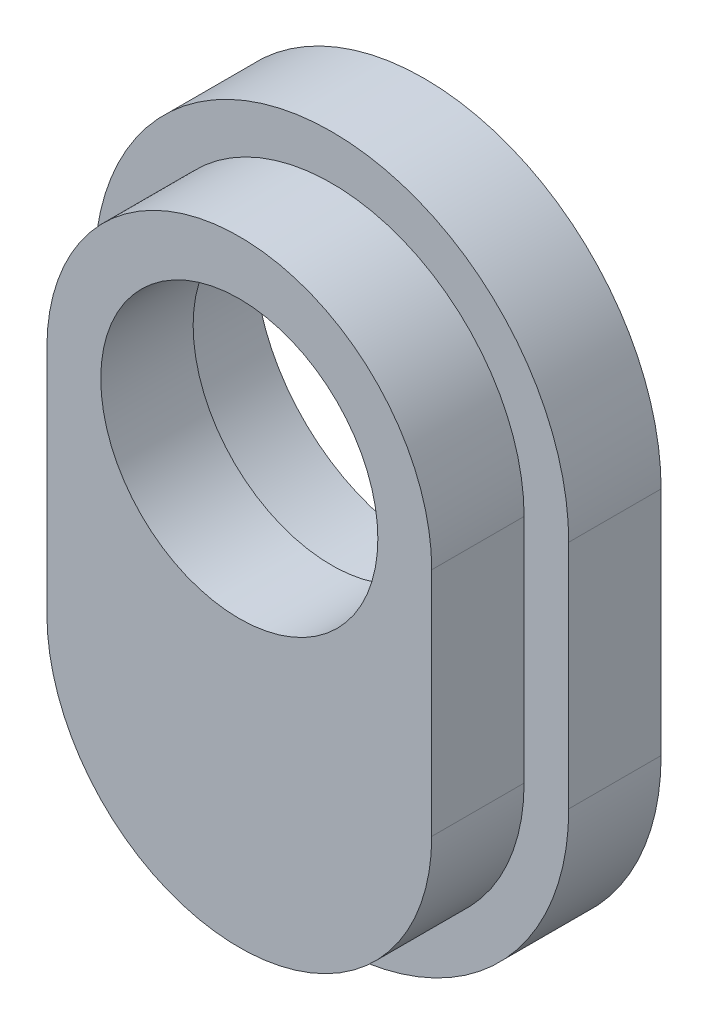
ISO-10303-21;
HEADER;
FILE_DESCRIPTION(('STEP AP214'),'2;1');
FILE_NAME('part.step','',(''),(''),'','','');
FILE_SCHEMA(('AUTOMOTIVE_DESIGN { 1 0 10303 214 1 1 1 1 }'));
ENDSEC;
DATA;
#1=APPLICATION_CONTEXT('core data for automotive mechanical design processes');
#2=APPLICATION_PROTOCOL_DEFINITION('international standard','automotive_design',2000,#1);
#3=PRODUCT_CONTEXT('',#1,'mechanical');
#4=PRODUCT('Part','Part','',(#3));
#5=PRODUCT_RELATED_PRODUCT_CATEGORY('part','',(#4));
#6=PRODUCT_DEFINITION_FORMATION('','',#4);
#7=PRODUCT_DEFINITION_CONTEXT('part definition',#1,'design');
#8=PRODUCT_DEFINITION('design','',#6,#7);
#9=PRODUCT_DEFINITION_SHAPE('','',#8);
#10=(LENGTH_UNIT() NAMED_UNIT(*) SI_UNIT(.MILLI.,.METRE.));
#11=(NAMED_UNIT(*) PLANE_ANGLE_UNIT() SI_UNIT($,.RADIAN.));
#12=(NAMED_UNIT(*) SI_UNIT($,.STERADIAN.) SOLID_ANGLE_UNIT());
#13=UNCERTAINTY_MEASURE_WITH_UNIT(LENGTH_MEASURE(1.E-05),#10,'distance_accuracy_value','');
#14=(GEOMETRIC_REPRESENTATION_CONTEXT(3) GLOBAL_UNCERTAINTY_ASSIGNED_CONTEXT((#13)) GLOBAL_UNIT_ASSIGNED_CONTEXT((#10,
#11,#12)) REPRESENTATION_CONTEXT('',''));
#15=CARTESIAN_POINT('',(0.,0.,0.));
#16=DIRECTION('',(0.,0.,1.));
#17=DIRECTION('',(1.,0.,0.));
#18=AXIS2_PLACEMENT_3D('',#15,#16,#17);
#19=CARTESIAN_POINT('',(0.,0.,6.));
#20=DIRECTION('',(0.,0.,-1.));
#21=DIRECTION('',(-1.,0.,0.));
#22=AXIS2_PLACEMENT_3D('',#19,#20,#21);
#23=CYLINDRICAL_SURFACE('',#22,4.5);
#24=CARTESIAN_POINT('',(0.,0.,6.));
#25=DIRECTION('',(0.,0.,1.));
#26=DIRECTION('',(1.,0.,0.));
#27=AXIS2_PLACEMENT_3D('',#24,#25,#26);
#28=CIRCLE('',#27,4.5);
#29=CARTESIAN_POINT('',(4.5,0.,6.));
#30=VERTEX_POINT('',#29);
#31=EDGE_CURVE('E152',#30,#30,#28,.T.);
#32=ORIENTED_EDGE('',*,*,#31,.T.);
#33=EDGE_LOOP('',(#32));
#34=FACE_BOUND('',#33,.T.);
#35=CARTESIAN_POINT('',(0.,0.,3.));
#36=DIRECTION('',(0.,0.,-1.));
#37=DIRECTION('',(-1.,0.,0.));
#38=AXIS2_PLACEMENT_3D('',#35,#36,#37);
#39=CIRCLE('',#38,4.5);
#40=CARTESIAN_POINT('',(-4.5,0.,3.));
#41=VERTEX_POINT('',#40);
#42=EDGE_CURVE('E36',#41,#41,#39,.T.);
#43=ORIENTED_EDGE('',*,*,#42,.T.);
#44=EDGE_LOOP('',(#43));
#45=FACE_BOUND('',#44,.T.);
#46=ADVANCED_FACE('F32',(#34,#45),#23,.F.);
#47=CARTESIAN_POINT('',(0.,0.,6.));
#48=DIRECTION('',(0.,0.,-1.));
#49=DIRECTION('',(-1.,0.,0.));
#50=AXIS2_PLACEMENT_3D('',#47,#48,#49);
#51=CYLINDRICAL_SURFACE('',#50,6.25);
#52=CARTESIAN_POINT('',(0.,0.,3.));
#53=DIRECTION('',(0.,0.,-1.));
#54=DIRECTION('',(-1.,0.,0.));
#55=AXIS2_PLACEMENT_3D('',#52,#53,#54);
#56=CIRCLE('',#55,6.25);
#57=CARTESIAN_POINT('',(-6.25,0.,3.));
#58=VERTEX_POINT('',#57);
#59=CARTESIAN_POINT('',(6.25,0.,3.));
#60=VERTEX_POINT('',#59);
#61=EDGE_CURVE('E48',#58,#60,#56,.T.);
#62=ORIENTED_EDGE('',*,*,#61,.F.);
#63=DIRECTION('',(0.,0.,-1.));
#64=VECTOR('',#63,1.);
#65=CARTESIAN_POINT('',(-6.25,0.,6.));
#66=LINE('',#65,#64);
#67=CARTESIAN_POINT('',(-6.25,0.,6.));
#68=VERTEX_POINT('',#67);
#69=EDGE_CURVE('E41',#68,#58,#66,.T.);
#70=ORIENTED_EDGE('',*,*,#69,.F.);
#71=CARTESIAN_POINT('',(0.,0.,6.));
#72=DIRECTION('',(0.,0.,1.));
#73=DIRECTION('',(1.,0.,0.));
#74=AXIS2_PLACEMENT_3D('',#71,#72,#73);
#75=CIRCLE('',#74,6.25);
#76=CARTESIAN_POINT('',(6.25,0.,6.));
#77=VERTEX_POINT('',#76);
#78=EDGE_CURVE('E155',#77,#68,#75,.T.);
#79=ORIENTED_EDGE('',*,*,#78,.F.);
#80=DIRECTION('',(0.,0.,-1.));
#81=VECTOR('',#80,1.);
#82=CARTESIAN_POINT('',(6.25,0.,6.));
#83=LINE('',#82,#81);
#84=EDGE_CURVE('E164',#77,#60,#83,.T.);
#85=ORIENTED_EDGE('',*,*,#84,.T.);
#86=EDGE_LOOP('',(#62,#70,#79,#85));
#87=FACE_BOUND('',#86,.T.);
#88=ADVANCED_FACE('F34',(#87),#51,.T.);
#89=CARTESIAN_POINT('',(-6.25,0.,6.));
#90=DIRECTION('',(1.,0.,0.));
#91=DIRECTION('',(0.,1.,0.));
#92=AXIS2_PLACEMENT_3D('',#89,#90,#91);
#93=PLANE('',#92);
#94=DIRECTION('',(0.,1.,0.));
#95=VECTOR('',#94,1.);
#96=CARTESIAN_POINT('',(-6.25,0.,3.));
#97=LINE('',#96,#95);
#98=CARTESIAN_POINT('',(-6.25,-7.5,3.));
#99=VERTEX_POINT('',#98);
#100=EDGE_CURVE('E55',#99,#58,#97,.T.);
#101=ORIENTED_EDGE('',*,*,#100,.F.);
#102=DIRECTION('',(0.,0.,-1.));
#103=VECTOR('',#102,1.);
#104=CARTESIAN_POINT('',(-6.25,-7.5,6.));
#105=LINE('',#104,#103);
#106=CARTESIAN_POINT('',(-6.25,-7.5,6.));
#107=VERTEX_POINT('',#106);
#108=EDGE_CURVE('E168',#107,#99,#105,.T.);
#109=ORIENTED_EDGE('',*,*,#108,.F.);
#110=DIRECTION('',(0.,-1.,0.));
#111=VECTOR('',#110,1.);
#112=CARTESIAN_POINT('',(-6.25,0.,6.));
#113=LINE('',#112,#111);
#114=EDGE_CURVE('E158',#68,#107,#113,.T.);
#115=ORIENTED_EDGE('',*,*,#114,.F.);
#116=ORIENTED_EDGE('',*,*,#69,.T.);
#117=EDGE_LOOP('',(#101,#109,#115,#116));
#118=FACE_BOUND('',#117,.T.);
#119=ADVANCED_FACE('F170',(#118),#93,.F.);
#120=CARTESIAN_POINT('',(0.,-7.5,6.));
#121=DIRECTION('',(0.,0.,-1.));
#122=DIRECTION('',(-1.,0.,0.));
#123=AXIS2_PLACEMENT_3D('',#120,#121,#122);
#124=CYLINDRICAL_SURFACE('',#123,6.25);
#125=CARTESIAN_POINT('',(0.,-7.5,3.));
#126=DIRECTION('',(0.,0.,-1.));
#127=DIRECTION('',(-1.,0.,0.));
#128=AXIS2_PLACEMENT_3D('',#125,#126,#127);
#129=CIRCLE('',#128,6.25);
#130=CARTESIAN_POINT('',(6.25,-7.5,3.));
#131=VERTEX_POINT('',#130);
#132=EDGE_CURVE('E144',#131,#99,#129,.T.);
#133=ORIENTED_EDGE('',*,*,#132,.F.);
#134=DIRECTION('',(0.,0.,-1.));
#135=VECTOR('',#134,1.);
#136=CARTESIAN_POINT('',(6.25,-7.5,6.));
#137=LINE('',#136,#135);
#138=CARTESIAN_POINT('',(6.25,-7.5,6.));
#139=VERTEX_POINT('',#138);
#140=EDGE_CURVE('E166',#139,#131,#137,.T.);
#141=ORIENTED_EDGE('',*,*,#140,.F.);
#142=CARTESIAN_POINT('',(0.,-7.5,6.));
#143=DIRECTION('',(0.,0.,1.));
#144=DIRECTION('',(1.,0.,0.));
#145=AXIS2_PLACEMENT_3D('',#142,#143,#144);
#146=CIRCLE('',#145,6.25);
#147=EDGE_CURVE('E160',#107,#139,#146,.T.);
#148=ORIENTED_EDGE('',*,*,#147,.F.);
#149=ORIENTED_EDGE('',*,*,#108,.T.);
#150=EDGE_LOOP('',(#133,#141,#148,#149));
#151=FACE_BOUND('',#150,.T.);
#152=ADVANCED_FACE('F175',(#151),#124,.T.);
#153=CARTESIAN_POINT('',(6.25,0.,6.));
#154=DIRECTION('',(-1.,0.,0.));
#155=DIRECTION('',(0.,-1.,0.));
#156=AXIS2_PLACEMENT_3D('',#153,#154,#155);
#157=PLANE('',#156);
#158=DIRECTION('',(0.,-1.,0.));
#159=VECTOR('',#158,1.);
#160=CARTESIAN_POINT('',(6.25,0.,3.));
#161=LINE('',#160,#159);
#162=EDGE_CURVE('E11',#60,#131,#161,.T.);
#163=ORIENTED_EDGE('',*,*,#162,.F.);
#164=ORIENTED_EDGE('',*,*,#84,.F.);
#165=DIRECTION('',(0.,1.,0.));
#166=VECTOR('',#165,1.);
#167=CARTESIAN_POINT('',(6.25,0.,6.));
#168=LINE('',#167,#166);
#169=EDGE_CURVE('E162',#139,#77,#168,.T.);
#170=ORIENTED_EDGE('',*,*,#169,.F.);
#171=ORIENTED_EDGE('',*,*,#140,.T.);
#172=EDGE_LOOP('',(#163,#164,#170,#171));
#173=FACE_BOUND('',#172,.T.);
#174=ADVANCED_FACE('F183',(#173),#157,.F.);
#175=CARTESIAN_POINT('',(0.,0.,6.));
#176=DIRECTION('',(0.,0.,1.));
#177=DIRECTION('',(1.,0.,0.));
#178=AXIS2_PLACEMENT_3D('',#175,#176,#177);
#179=PLANE('',#178);
#180=ORIENTED_EDGE('',*,*,#78,.T.);
#181=ORIENTED_EDGE('',*,*,#114,.T.);
#182=ORIENTED_EDGE('',*,*,#147,.T.);
#183=ORIENTED_EDGE('',*,*,#169,.T.);
#184=EDGE_LOOP('',(#180,#181,#182,#183));
#185=FACE_BOUND('',#184,.T.);
#186=ORIENTED_EDGE('',*,*,#31,.F.);
#187=EDGE_LOOP('',(#186));
#188=FACE_BOUND('',#187,.T.);
#189=ADVANCED_FACE('F179',(#185,#188),#179,.T.);
#190=CARTESIAN_POINT('',(0.,0.,0.));
#191=DIRECTION('',(0.,0.,1.));
#192=DIRECTION('',(1.,0.,0.));
#193=AXIS2_PLACEMENT_3D('',#190,#191,#192);
#194=PLANE('',#193);
#195=CARTESIAN_POINT('',(0.,0.,0.));
#196=DIRECTION('',(0.,0.,-1.));
#197=DIRECTION('',(-1.,0.,0.));
#198=AXIS2_PLACEMENT_3D('',#195,#196,#197);
#199=CIRCLE('',#198,5.5);
#200=CARTESIAN_POINT('',(-5.5,0.,0.));
#201=VERTEX_POINT('',#200);
#202=EDGE_CURVE('E133',#201,#201,#199,.T.);
#203=ORIENTED_EDGE('',*,*,#202,.F.);
#204=EDGE_LOOP('',(#203));
#205=FACE_BOUND('',#204,.T.);
#206=CARTESIAN_POINT('',(0.,0.,0.));
#207=DIRECTION('',(0.,0.,-1.));
#208=DIRECTION('',(-1.,0.,0.));
#209=AXIS2_PLACEMENT_3D('',#206,#207,#208);
#210=CIRCLE('',#209,7.7);
#211=CARTESIAN_POINT('',(-7.7,0.,0.));
#212=VERTEX_POINT('',#211);
#213=CARTESIAN_POINT('',(7.7,0.,0.));
#214=VERTEX_POINT('',#213);
#215=EDGE_CURVE('E138',#212,#214,#210,.T.);
#216=ORIENTED_EDGE('',*,*,#215,.T.);
#217=DIRECTION('',(0.,-1.,0.));
#218=VECTOR('',#217,1.);
#219=CARTESIAN_POINT('',(7.7,0.,0.));
#220=LINE('',#219,#218);
#221=CARTESIAN_POINT('',(7.7,-7.5,0.));
#222=VERTEX_POINT('',#221);
#223=EDGE_CURVE('E106',#214,#222,#220,.T.);
#224=ORIENTED_EDGE('',*,*,#223,.T.);
#225=CARTESIAN_POINT('',(0.,-7.5,0.));
#226=DIRECTION('',(0.,0.,-1.));
#227=DIRECTION('',(-1.,0.,0.));
#228=AXIS2_PLACEMENT_3D('',#225,#226,#227);
#229=CIRCLE('',#228,7.7);
#230=CARTESIAN_POINT('',(-7.7,-7.5,0.));
#231=VERTEX_POINT('',#230);
#232=EDGE_CURVE('E130',#222,#231,#229,.T.);
#233=ORIENTED_EDGE('',*,*,#232,.T.);
#234=DIRECTION('',(0.,1.,0.));
#235=VECTOR('',#234,1.);
#236=CARTESIAN_POINT('',(-7.7,0.,0.));
#237=LINE('',#236,#235);
#238=EDGE_CURVE('E127',#231,#212,#237,.T.);
#239=ORIENTED_EDGE('',*,*,#238,.T.);
#240=EDGE_LOOP('',(#216,#224,#233,#239));
#241=FACE_BOUND('',#240,.T.);
#242=ADVANCED_FACE('F190',(#205,#241),#194,.F.);
#243=CARTESIAN_POINT('',(0.,0.,3.));
#244=DIRECTION('',(0.,0.,-1.));
#245=DIRECTION('',(-1.,0.,0.));
#246=AXIS2_PLACEMENT_3D('',#243,#244,#245);
#247=PLANE('',#246);
#248=CARTESIAN_POINT('',(0.,0.,3.));
#249=DIRECTION('',(0.,0.,-1.));
#250=DIRECTION('',(-1.,0.,0.));
#251=AXIS2_PLACEMENT_3D('',#248,#249,#250);
#252=CIRCLE('',#251,7.7);
#253=CARTESIAN_POINT('',(-7.7,0.,3.));
#254=VERTEX_POINT('',#253);
#255=CARTESIAN_POINT('',(7.7,0.,3.));
#256=VERTEX_POINT('',#255);
#257=EDGE_CURVE('E120',#254,#256,#252,.T.);
#258=ORIENTED_EDGE('',*,*,#257,.F.);
#259=DIRECTION('',(0.,1.,0.));
#260=VECTOR('',#259,1.);
#261=CARTESIAN_POINT('',(-7.7,0.,3.));
#262=LINE('',#261,#260);
#263=CARTESIAN_POINT('',(-7.7,-7.5,3.));
#264=VERTEX_POINT('',#263);
#265=EDGE_CURVE('E112',#264,#254,#262,.T.);
#266=ORIENTED_EDGE('',*,*,#265,.F.);
#267=CARTESIAN_POINT('',(0.,-7.5,3.));
#268=DIRECTION('',(0.,0.,-1.));
#269=DIRECTION('',(-1.,0.,0.));
#270=AXIS2_PLACEMENT_3D('',#267,#268,#269);
#271=CIRCLE('',#270,7.7);
#272=CARTESIAN_POINT('',(7.7,-7.5,3.));
#273=VERTEX_POINT('',#272);
#274=EDGE_CURVE('E123',#273,#264,#271,.T.);
#275=ORIENTED_EDGE('',*,*,#274,.F.);
#276=DIRECTION('',(0.,-1.,0.));
#277=VECTOR('',#276,1.);
#278=CARTESIAN_POINT('',(7.7,0.,3.));
#279=LINE('',#278,#277);
#280=EDGE_CURVE('E104',#256,#273,#279,.T.);
#281=ORIENTED_EDGE('',*,*,#280,.F.);
#282=EDGE_LOOP('',(#258,#266,#275,#281));
#283=FACE_BOUND('',#282,.T.);
#284=ORIENTED_EDGE('',*,*,#100,.T.);
#285=ORIENTED_EDGE('',*,*,#61,.T.);
#286=ORIENTED_EDGE('',*,*,#162,.T.);
#287=ORIENTED_EDGE('',*,*,#132,.T.);
#288=EDGE_LOOP('',(#284,#285,#286,#287));
#289=FACE_BOUND('',#288,.T.);
#290=ADVANCED_FACE('F117',(#283,#289),#247,.F.);
#291=CARTESIAN_POINT('',(0.,0.,3.));
#292=DIRECTION('',(0.,0.,-1.));
#293=DIRECTION('',(-1.,0.,0.));
#294=AXIS2_PLACEMENT_3D('',#291,#292,#293);
#295=CYLINDRICAL_SURFACE('',#294,7.7);
#296=ORIENTED_EDGE('',*,*,#215,.F.);
#297=DIRECTION('',(0.,0.,-1.));
#298=VECTOR('',#297,1.);
#299=CARTESIAN_POINT('',(-7.7,0.,3.));
#300=LINE('',#299,#298);
#301=EDGE_CURVE('E126',#254,#212,#300,.T.);
#302=ORIENTED_EDGE('',*,*,#301,.F.);
#303=ORIENTED_EDGE('',*,*,#257,.T.);
#304=DIRECTION('',(0.,0.,-1.));
#305=VECTOR('',#304,1.);
#306=CARTESIAN_POINT('',(7.7,0.,3.));
#307=LINE('',#306,#305);
#308=EDGE_CURVE('E101',#256,#214,#307,.T.);
#309=ORIENTED_EDGE('',*,*,#308,.T.);
#310=EDGE_LOOP('',(#296,#302,#303,#309));
#311=FACE_BOUND('',#310,.T.);
#312=ADVANCED_FACE('F125',(#311),#295,.T.);
#313=CARTESIAN_POINT('',(-7.7,0.,3.));
#314=DIRECTION('',(-1.,0.,0.));
#315=DIRECTION('',(0.,-1.,0.));
#316=AXIS2_PLACEMENT_3D('',#313,#314,#315);
#317=PLANE('',#316);
#318=ORIENTED_EDGE('',*,*,#238,.F.);
#319=DIRECTION('',(0.,0.,-1.));
#320=VECTOR('',#319,1.);
#321=CARTESIAN_POINT('',(-7.7,-7.5,3.));
#322=LINE('',#321,#320);
#323=EDGE_CURVE('E145',#264,#231,#322,.T.);
#324=ORIENTED_EDGE('',*,*,#323,.F.);
#325=ORIENTED_EDGE('',*,*,#265,.T.);
#326=ORIENTED_EDGE('',*,*,#301,.T.);
#327=EDGE_LOOP('',(#318,#324,#325,#326));
#328=FACE_BOUND('',#327,.T.);
#329=ADVANCED_FACE('F215',(#328),#317,.T.);
#330=CARTESIAN_POINT('',(0.,-7.5,3.));
#331=DIRECTION('',(0.,0.,-1.));
#332=DIRECTION('',(-1.,0.,0.));
#333=AXIS2_PLACEMENT_3D('',#330,#331,#332);
#334=CYLINDRICAL_SURFACE('',#333,7.7);
#335=ORIENTED_EDGE('',*,*,#232,.F.);
#336=DIRECTION('',(0.,0.,-1.));
#337=VECTOR('',#336,1.);
#338=CARTESIAN_POINT('',(7.7,-7.5,3.));
#339=LINE('',#338,#337);
#340=EDGE_CURVE('E111',#273,#222,#339,.T.);
#341=ORIENTED_EDGE('',*,*,#340,.F.);
#342=ORIENTED_EDGE('',*,*,#274,.T.);
#343=ORIENTED_EDGE('',*,*,#323,.T.);
#344=EDGE_LOOP('',(#335,#341,#342,#343));
#345=FACE_BOUND('',#344,.T.);
#346=ADVANCED_FACE('F217',(#345),#334,.T.);
#347=CARTESIAN_POINT('',(7.7,0.,3.));
#348=DIRECTION('',(1.,0.,0.));
#349=DIRECTION('',(0.,1.,0.));
#350=AXIS2_PLACEMENT_3D('',#347,#348,#349);
#351=PLANE('',#350);
#352=ORIENTED_EDGE('',*,*,#223,.F.);
#353=ORIENTED_EDGE('',*,*,#308,.F.);
#354=ORIENTED_EDGE('',*,*,#280,.T.);
#355=ORIENTED_EDGE('',*,*,#340,.T.);
#356=EDGE_LOOP('',(#352,#353,#354,#355));
#357=FACE_BOUND('',#356,.T.);
#358=ADVANCED_FACE('F103',(#357),#351,.T.);
#359=CARTESIAN_POINT('',(0.,0.,3.));
#360=DIRECTION('',(0.,0.,-1.));
#361=DIRECTION('',(-1.,0.,0.));
#362=AXIS2_PLACEMENT_3D('',#359,#360,#361);
#363=CYLINDRICAL_SURFACE('',#362,5.5);
#364=CARTESIAN_POINT('',(0.,0.,3.));
#365=DIRECTION('',(0.,0.,-1.));
#366=DIRECTION('',(-1.,0.,0.));
#367=AXIS2_PLACEMENT_3D('',#364,#365,#366);
#368=CIRCLE('',#367,5.5);
#369=CARTESIAN_POINT('',(-5.5,0.,3.));
#370=VERTEX_POINT('',#369);
#371=EDGE_CURVE('E240',#370,#370,#368,.T.);
#372=ORIENTED_EDGE('',*,*,#371,.F.);
#373=EDGE_LOOP('',(#372));
#374=FACE_BOUND('',#373,.T.);
#375=ORIENTED_EDGE('',*,*,#202,.T.);
#376=EDGE_LOOP('',(#375));
#377=FACE_BOUND('',#376,.T.);
#378=ADVANCED_FACE('F224',(#374,#377),#363,.F.);
#379=CARTESIAN_POINT('',(0.,0.,3.));
#380=DIRECTION('',(0.,0.,-1.));
#381=DIRECTION('',(-1.,0.,0.));
#382=AXIS2_PLACEMENT_3D('',#379,#380,#381);
#383=PLANE('',#382);
#384=ORIENTED_EDGE('',*,*,#42,.F.);
#385=EDGE_LOOP('',(#384));
#386=FACE_BOUND('',#385,.T.);
#387=ORIENTED_EDGE('',*,*,#371,.T.);
#388=EDGE_LOOP('',(#387));
#389=FACE_BOUND('',#388,.T.);
#390=ADVANCED_FACE('F229',(#386,#389),#383,.T.);
#391=CLOSED_SHELL('',(#46,#88,#119,#152,#174,#189,#242,#290,#312,#329,#346,#358,#378,#390));
#392=MANIFOLD_SOLID_BREP('B2',#391);
#393=ADVANCED_BREP_SHAPE_REPRESENTATION('',(#18,#392),#14);
#394=SHAPE_DEFINITION_REPRESENTATION(#9,#393);
ENDSEC;
END-ISO-10303-21;
